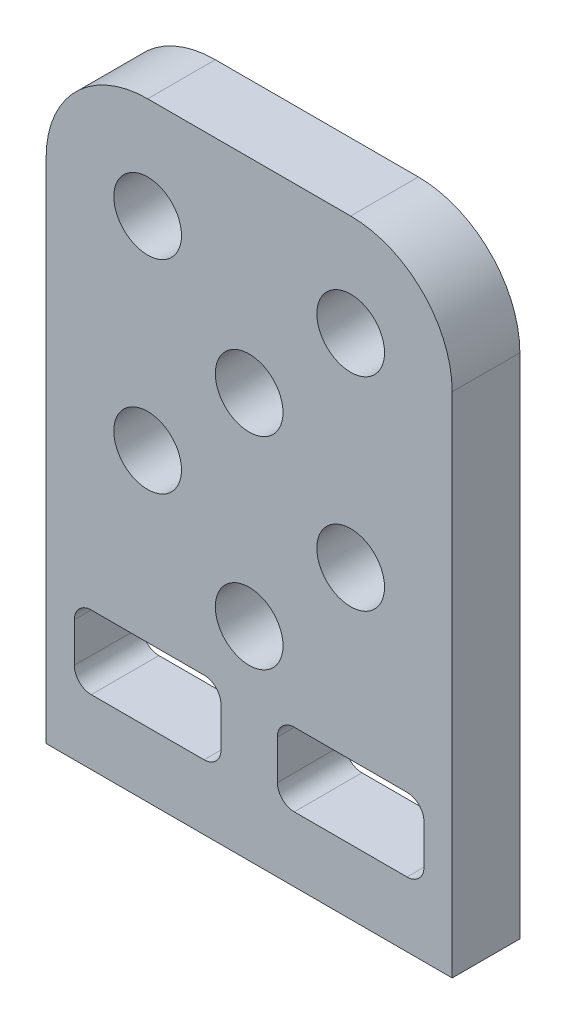
ISO-10303-21;
HEADER;
FILE_DESCRIPTION(('STEP AP214'),'2;1');
FILE_NAME('part.step','',(''),(''),'','','');
FILE_SCHEMA(('AUTOMOTIVE_DESIGN { 1 0 10303 214 1 1 1 1 }'));
ENDSEC;
DATA;
#1=APPLICATION_CONTEXT('core data for automotive mechanical design processes');
#2=APPLICATION_PROTOCOL_DEFINITION('international standard','automotive_design',2000,#1);
#3=PRODUCT_CONTEXT('',#1,'mechanical');
#4=PRODUCT('Part','Part','',(#3));
#5=PRODUCT_RELATED_PRODUCT_CATEGORY('part','',(#4));
#6=PRODUCT_DEFINITION_FORMATION('','',#4);
#7=PRODUCT_DEFINITION_CONTEXT('part definition',#1,'design');
#8=PRODUCT_DEFINITION('design','',#6,#7);
#9=PRODUCT_DEFINITION_SHAPE('','',#8);
#10=(LENGTH_UNIT() NAMED_UNIT(*) SI_UNIT(.MILLI.,.METRE.));
#11=(NAMED_UNIT(*) PLANE_ANGLE_UNIT() SI_UNIT($,.RADIAN.));
#12=(NAMED_UNIT(*) SI_UNIT($,.STERADIAN.) SOLID_ANGLE_UNIT());
#13=UNCERTAINTY_MEASURE_WITH_UNIT(LENGTH_MEASURE(1.E-05),#10,'distance_accuracy_value','');
#14=(GEOMETRIC_REPRESENTATION_CONTEXT(3) GLOBAL_UNCERTAINTY_ASSIGNED_CONTEXT((#13)) GLOBAL_UNIT_ASSIGNED_CONTEXT((#10,
#11,#12)) REPRESENTATION_CONTEXT('',''));
#15=CARTESIAN_POINT('',(0.,0.,0.));
#16=DIRECTION('',(0.,0.,1.));
#17=DIRECTION('',(1.,0.,0.));
#18=AXIS2_PLACEMENT_3D('',#15,#16,#17);
#19=CARTESIAN_POINT('',(178.7270545748,213.1787200631,3.));
#20=DIRECTION('',(0.,0.,1.));
#21=DIRECTION('',(1.,0.,0.));
#22=AXIS2_PLACEMENT_3D('',#19,#20,#21);
#23=PLANE('',#22);
#24=DIRECTION('',(1.,0.,0.));
#25=VECTOR('',#24,1.);
#26=CARTESIAN_POINT('',(190.2270584169,193.5537200631,3.));
#27=LINE('',#26,#25);
#28=CARTESIAN_POINT('',(185.2270584169,193.5537200631,3.));
#29=VERTEX_POINT('',#28);
#30=CARTESIAN_POINT('',(190.2270584169,193.5537200631,3.));
#31=VERTEX_POINT('',#30);
#32=EDGE_CURVE('E249',#29,#31,#27,.T.);
#33=ORIENTED_EDGE('',*,*,#32,.F.);
#34=CARTESIAN_POINT('',(185.2270584169,194.3037200631,3.));
#35=DIRECTION('',(0.,0.,1.));
#36=DIRECTION('',(1.,0.,0.));
#37=AXIS2_PLACEMENT_3D('',#34,#35,#36);
#38=CIRCLE('',#37,0.750000000000001);
#39=CARTESIAN_POINT('',(184.4770584169,194.3037200631,3.));
#40=VERTEX_POINT('',#39);
#41=EDGE_CURVE('E247',#40,#29,#38,.T.);
#42=ORIENTED_EDGE('',*,*,#41,.F.);
#43=DIRECTION('',(0.,-1.,0.));
#44=VECTOR('',#43,1.);
#45=CARTESIAN_POINT('',(184.4770584169,194.3037200631,3.));
#46=LINE('',#45,#44);
#47=CARTESIAN_POINT('',(184.4770584169,196.0537200631,3.));
#48=VERTEX_POINT('',#47);
#49=EDGE_CURVE('E263',#48,#40,#46,.T.);
#50=ORIENTED_EDGE('',*,*,#49,.F.);
#51=CARTESIAN_POINT('',(185.2270584169,196.0537200631,3.));
#52=DIRECTION('',(0.,0.,1.));
#53=DIRECTION('',(1.,0.,0.));
#54=AXIS2_PLACEMENT_3D('',#51,#52,#53);
#55=CIRCLE('',#54,0.750000000000001);
#56=CARTESIAN_POINT('',(185.2270584169,196.8037200631,3.));
#57=VERTEX_POINT('',#56);
#58=EDGE_CURVE('E260',#57,#48,#55,.T.);
#59=ORIENTED_EDGE('',*,*,#58,.F.);
#60=DIRECTION('',(-1.,0.,0.));
#61=VECTOR('',#60,1.);
#62=CARTESIAN_POINT('',(185.2270584169,196.8037200631,3.));
#63=LINE('',#62,#61);
#64=CARTESIAN_POINT('',(190.2270584169,196.8037200631,3.));
#65=VERTEX_POINT('',#64);
#66=EDGE_CURVE('E258',#65,#57,#63,.T.);
#67=ORIENTED_EDGE('',*,*,#66,.F.);
#68=CARTESIAN_POINT('',(190.2270584169,196.0537200631,3.));
#69=DIRECTION('',(0.,0.,1.));
#70=DIRECTION('',(1.,0.,0.));
#71=AXIS2_PLACEMENT_3D('',#68,#69,#70);
#72=CIRCLE('',#71,0.750000000000001);
#73=CARTESIAN_POINT('',(190.9770584169,196.0537200631,3.));
#74=VERTEX_POINT('',#73);
#75=EDGE_CURVE('E256',#74,#65,#72,.T.);
#76=ORIENTED_EDGE('',*,*,#75,.F.);
#77=DIRECTION('',(0.,1.,0.));
#78=VECTOR('',#77,1.);
#79=CARTESIAN_POINT('',(190.9770584169,196.0537200631,3.));
#80=LINE('',#79,#78);
#81=CARTESIAN_POINT('',(190.9770584169,194.3037200631,3.));
#82=VERTEX_POINT('',#81);
#83=EDGE_CURVE('E254',#82,#74,#80,.T.);
#84=ORIENTED_EDGE('',*,*,#83,.F.);
#85=CARTESIAN_POINT('',(190.2270584169,194.3037200631,3.));
#86=DIRECTION('',(0.,0.,1.));
#87=DIRECTION('',(1.,0.,0.));
#88=AXIS2_PLACEMENT_3D('',#85,#86,#87);
#89=CIRCLE('',#88,0.750000000000001);
#90=EDGE_CURVE('E252',#31,#82,#89,.T.);
#91=ORIENTED_EDGE('',*,*,#90,.F.);
#92=EDGE_LOOP('',(#33,#42,#50,#59,#67,#76,#84,#91));
#93=FACE_BOUND('',#92,.T.);
#94=CARTESIAN_POINT('',(187.7270545748,213.1787200631,3.));
#95=DIRECTION('',(0.,0.,1.));
#96=DIRECTION('',(1.,0.,0.));
#97=AXIS2_PLACEMENT_3D('',#94,#95,#96);
#98=CIRCLE('',#97,1.5);
#99=CARTESIAN_POINT('',(189.2270545748,213.1787200631,3.));
#100=VERTEX_POINT('',#99);
#101=EDGE_CURVE('E312',#100,#100,#98,.T.);
#102=ORIENTED_EDGE('',*,*,#101,.F.);
#103=EDGE_LOOP('',(#102));
#104=FACE_BOUND('',#103,.T.);
#105=CARTESIAN_POINT('',(187.7270545748,204.1787200631,3.));
#106=DIRECTION('',(0.,0.,1.));
#107=DIRECTION('',(1.,0.,0.));
#108=AXIS2_PLACEMENT_3D('',#105,#106,#107);
#109=CIRCLE('',#108,1.5);
#110=CARTESIAN_POINT('',(189.2270545748,204.1787200631,3.));
#111=VERTEX_POINT('',#110);
#112=EDGE_CURVE('E324',#111,#111,#109,.T.);
#113=ORIENTED_EDGE('',*,*,#112,.F.);
#114=EDGE_LOOP('',(#113));
#115=FACE_BOUND('',#114,.T.);
#116=CARTESIAN_POINT('',(183.2270545748,199.6787200631,3.));
#117=DIRECTION('',(0.,0.,1.));
#118=DIRECTION('',(1.,0.,0.));
#119=AXIS2_PLACEMENT_3D('',#116,#117,#118);
#120=CIRCLE('',#119,1.5);
#121=CARTESIAN_POINT('',(184.7270545748,199.6787200631,3.));
#122=VERTEX_POINT('',#121);
#123=EDGE_CURVE('E336',#122,#122,#120,.T.);
#124=ORIENTED_EDGE('',*,*,#123,.F.);
#125=EDGE_LOOP('',(#124));
#126=FACE_BOUND('',#125,.T.);
#127=CARTESIAN_POINT('',(178.7270545748,213.1787200631,3.));
#128=DIRECTION('',(0.,0.,1.));
#129=DIRECTION('',(1.,0.,0.));
#130=AXIS2_PLACEMENT_3D('',#127,#128,#129);
#131=CIRCLE('',#130,4.5);
#132=CARTESIAN_POINT('',(178.7270545748,217.6787200631,3.));
#133=VERTEX_POINT('',#132);
#134=CARTESIAN_POINT('',(174.2270545748,213.1787200631,3.));
#135=VERTEX_POINT('',#134);
#136=EDGE_CURVE('E342',#133,#135,#131,.T.);
#137=ORIENTED_EDGE('',*,*,#136,.T.);
#138=DIRECTION('',(0.,-1.,0.));
#139=VECTOR('',#138,1.);
#140=CARTESIAN_POINT('',(174.2270545748,213.1787200631,3.));
#141=LINE('',#140,#139);
#142=CARTESIAN_POINT('',(174.2270545748,190.6758849413,3.));
#143=VERTEX_POINT('',#142);
#144=EDGE_CURVE('E345',#135,#143,#141,.T.);
#145=ORIENTED_EDGE('',*,*,#144,.T.);
#146=DIRECTION('',(1.,0.,0.));
#147=VECTOR('',#146,1.);
#148=CARTESIAN_POINT('',(174.2270545748,190.6758849413,3.));
#149=LINE('',#148,#147);
#150=CARTESIAN_POINT('',(192.2270545748,190.6758849413,3.));
#151=VERTEX_POINT('',#150);
#152=EDGE_CURVE('E348',#143,#151,#149,.T.);
#153=ORIENTED_EDGE('',*,*,#152,.T.);
#154=DIRECTION('',(0.,1.,0.));
#155=VECTOR('',#154,1.);
#156=CARTESIAN_POINT('',(192.2270545748,190.6758849413,3.));
#157=LINE('',#156,#155);
#158=CARTESIAN_POINT('',(192.2270545748,213.1787200631,3.));
#159=VERTEX_POINT('',#158);
#160=EDGE_CURVE('E350',#151,#159,#157,.T.);
#161=ORIENTED_EDGE('',*,*,#160,.T.);
#162=CARTESIAN_POINT('',(187.7270545748,213.1787200631,3.));
#163=DIRECTION('',(0.,0.,1.));
#164=DIRECTION('',(1.,0.,0.));
#165=AXIS2_PLACEMENT_3D('',#162,#163,#164);
#166=CIRCLE('',#165,4.5);
#167=CARTESIAN_POINT('',(187.7270545748,217.6787200631,3.));
#168=VERTEX_POINT('',#167);
#169=EDGE_CURVE('E352',#159,#168,#166,.T.);
#170=ORIENTED_EDGE('',*,*,#169,.T.);
#171=DIRECTION('',(-1.,0.,0.));
#172=VECTOR('',#171,1.);
#173=CARTESIAN_POINT('',(187.7270545748,217.6787200631,3.));
#174=LINE('',#173,#172);
#175=EDGE_CURVE('E354',#168,#133,#174,.T.);
#176=ORIENTED_EDGE('',*,*,#175,.T.);
#177=EDGE_LOOP('',(#137,#145,#153,#161,#170,#176));
#178=FACE_BOUND('',#177,.T.);
#179=CARTESIAN_POINT('',(183.2270545748,208.632069818,3.));
#180=DIRECTION('',(0.,0.,1.));
#181=DIRECTION('',(1.,0.,0.));
#182=AXIS2_PLACEMENT_3D('',#179,#180,#181);
#183=CIRCLE('',#182,1.5);
#184=CARTESIAN_POINT('',(184.7270545748,208.632069818,3.));
#185=VERTEX_POINT('',#184);
#186=EDGE_CURVE('E330',#185,#185,#183,.T.);
#187=ORIENTED_EDGE('',*,*,#186,.F.);
#188=EDGE_LOOP('',(#187));
#189=FACE_BOUND('',#188,.T.);
#190=CARTESIAN_POINT('',(178.7270545748,204.1787200631,3.));
#191=DIRECTION('',(0.,0.,1.));
#192=DIRECTION('',(1.,0.,0.));
#193=AXIS2_PLACEMENT_3D('',#190,#191,#192);
#194=CIRCLE('',#193,1.5);
#195=CARTESIAN_POINT('',(180.2270545748,204.1787200631,3.));
#196=VERTEX_POINT('',#195);
#197=EDGE_CURVE('E318',#196,#196,#194,.T.);
#198=ORIENTED_EDGE('',*,*,#197,.F.);
#199=EDGE_LOOP('',(#198));
#200=FACE_BOUND('',#199,.T.);
#201=CARTESIAN_POINT('',(178.7270545748,213.1787200631,3.));
#202=DIRECTION('',(0.,0.,1.));
#203=DIRECTION('',(1.,0.,0.));
#204=AXIS2_PLACEMENT_3D('',#201,#202,#203);
#205=CIRCLE('',#204,1.5);
#206=CARTESIAN_POINT('',(180.2270545748,213.1787200631,3.));
#207=VERTEX_POINT('',#206);
#208=EDGE_CURVE('E306',#207,#207,#205,.T.);
#209=ORIENTED_EDGE('',*,*,#208,.F.);
#210=EDGE_LOOP('',(#209));
#211=FACE_BOUND('',#210,.T.);
#212=DIRECTION('',(1.,0.,0.));
#213=VECTOR('',#212,1.);
#214=CARTESIAN_POINT('',(181.2270584169,193.5537200631,3.));
#215=LINE('',#214,#213);
#216=CARTESIAN_POINT('',(176.2270584169,193.5537200631,3.));
#217=VERTEX_POINT('',#216);
#218=CARTESIAN_POINT('',(181.2270584169,193.5537200631,3.));
#219=VERTEX_POINT('',#218);
#220=EDGE_CURVE('E190',#217,#219,#215,.T.);
#221=ORIENTED_EDGE('',*,*,#220,.F.);
#222=CARTESIAN_POINT('',(176.2270584169,194.3037200631,3.));
#223=DIRECTION('',(0.,0.,1.));
#224=DIRECTION('',(1.,0.,0.));
#225=AXIS2_PLACEMENT_3D('',#222,#223,#224);
#226=CIRCLE('',#225,0.750000000000001);
#227=CARTESIAN_POINT('',(175.4770584169,194.3037200631,3.));
#228=VERTEX_POINT('',#227);
#229=EDGE_CURVE('E182',#228,#217,#226,.T.);
#230=ORIENTED_EDGE('',*,*,#229,.F.);
#231=DIRECTION('',(0.,-1.,0.));
#232=VECTOR('',#231,1.);
#233=CARTESIAN_POINT('',(175.4770584169,194.3037200631,3.));
#234=LINE('',#233,#232);
#235=CARTESIAN_POINT('',(175.4770584169,196.0537200631,3.));
#236=VERTEX_POINT('',#235);
#237=EDGE_CURVE('E215',#236,#228,#234,.T.);
#238=ORIENTED_EDGE('',*,*,#237,.F.);
#239=CARTESIAN_POINT('',(176.2270584169,196.0537200631,3.));
#240=DIRECTION('',(0.,0.,1.));
#241=DIRECTION('',(1.,0.,0.));
#242=AXIS2_PLACEMENT_3D('',#239,#240,#241);
#243=CIRCLE('',#242,0.750000000000001);
#244=CARTESIAN_POINT('',(176.2270584169,196.8037200631,3.));
#245=VERTEX_POINT('',#244);
#246=EDGE_CURVE('E213',#245,#236,#243,.T.);
#247=ORIENTED_EDGE('',*,*,#246,.F.);
#248=DIRECTION('',(-1.,0.,0.));
#249=VECTOR('',#248,1.);
#250=CARTESIAN_POINT('',(176.2270584169,196.8037200631,3.));
#251=LINE('',#250,#249);
#252=CARTESIAN_POINT('',(181.2270584169,196.8037200631,3.));
#253=VERTEX_POINT('',#252);
#254=EDGE_CURVE('E211',#253,#245,#251,.T.);
#255=ORIENTED_EDGE('',*,*,#254,.F.);
#256=CARTESIAN_POINT('',(181.2270584169,196.0537200631,3.));
#257=DIRECTION('',(0.,0.,1.));
#258=DIRECTION('',(1.,0.,0.));
#259=AXIS2_PLACEMENT_3D('',#256,#257,#258);
#260=CIRCLE('',#259,0.750000000000001);
#261=CARTESIAN_POINT('',(181.9770584169,196.0537200631,3.));
#262=VERTEX_POINT('',#261);
#263=EDGE_CURVE('E209',#262,#253,#260,.T.);
#264=ORIENTED_EDGE('',*,*,#263,.F.);
#265=DIRECTION('',(0.,1.,0.));
#266=VECTOR('',#265,1.);
#267=CARTESIAN_POINT('',(181.9770584169,196.0537200631,3.));
#268=LINE('',#267,#266);
#269=CARTESIAN_POINT('',(181.9770584169,194.3037200631,3.));
#270=VERTEX_POINT('',#269);
#271=EDGE_CURVE('E205',#270,#262,#268,.T.);
#272=ORIENTED_EDGE('',*,*,#271,.F.);
#273=CARTESIAN_POINT('',(181.2270584169,194.3037200631,3.));
#274=DIRECTION('',(0.,0.,1.));
#275=DIRECTION('',(1.,0.,0.));
#276=AXIS2_PLACEMENT_3D('',#273,#274,#275);
#277=CIRCLE('',#276,0.750000000000001);
#278=EDGE_CURVE('E203',#219,#270,#277,.T.);
#279=ORIENTED_EDGE('',*,*,#278,.F.);
#280=EDGE_LOOP('',(#221,#230,#238,#247,#255,#264,#272,#279));
#281=FACE_BOUND('',#280,.T.);
#282=ADVANCED_FACE('F33',(#93,#104,#115,#126,#178,#189,#200,#211,#281),#23,.T.);
#283=CARTESIAN_POINT('',(178.7270545748,213.1787200631,0.));
#284=DIRECTION('',(0.,0.,1.));
#285=DIRECTION('',(1.,0.,0.));
#286=AXIS2_PLACEMENT_3D('',#283,#284,#285);
#287=PLANE('',#286);
#288=CARTESIAN_POINT('',(185.2270584169,194.3037200631,0.));
#289=DIRECTION('',(0.,0.,1.));
#290=DIRECTION('',(1.,0.,0.));
#291=AXIS2_PLACEMENT_3D('',#288,#289,#290);
#292=CIRCLE('',#291,0.750000000000001);
#293=CARTESIAN_POINT('',(184.4770584169,194.3037200631,0.));
#294=VERTEX_POINT('',#293);
#295=CARTESIAN_POINT('',(185.2270584169,193.5537200631,0.));
#296=VERTEX_POINT('',#295);
#297=EDGE_CURVE('E198',#294,#296,#292,.T.);
#298=ORIENTED_EDGE('',*,*,#297,.T.);
#299=DIRECTION('',(1.,0.,0.));
#300=VECTOR('',#299,1.);
#301=CARTESIAN_POINT('',(190.2270584169,193.5537200631,0.));
#302=LINE('',#301,#300);
#303=CARTESIAN_POINT('',(190.2270584169,193.5537200631,0.));
#304=VERTEX_POINT('',#303);
#305=EDGE_CURVE('E268',#296,#304,#302,.T.);
#306=ORIENTED_EDGE('',*,*,#305,.T.);
#307=CARTESIAN_POINT('',(190.2270584169,194.3037200631,0.));
#308=DIRECTION('',(0.,0.,1.));
#309=DIRECTION('',(1.,0.,0.));
#310=AXIS2_PLACEMENT_3D('',#307,#308,#309);
#311=CIRCLE('',#310,0.750000000000001);
#312=CARTESIAN_POINT('',(190.9770584169,194.3037200631,0.));
#313=VERTEX_POINT('',#312);
#314=EDGE_CURVE('E271',#304,#313,#311,.T.);
#315=ORIENTED_EDGE('',*,*,#314,.T.);
#316=DIRECTION('',(0.,1.,0.));
#317=VECTOR('',#316,1.);
#318=CARTESIAN_POINT('',(190.9770584169,196.0537200631,0.));
#319=LINE('',#318,#317);
#320=CARTESIAN_POINT('',(190.9770584169,196.0537200631,0.));
#321=VERTEX_POINT('',#320);
#322=EDGE_CURVE('E274',#313,#321,#319,.T.);
#323=ORIENTED_EDGE('',*,*,#322,.T.);
#324=CARTESIAN_POINT('',(190.2270584169,196.0537200631,0.));
#325=DIRECTION('',(0.,0.,1.));
#326=DIRECTION('',(1.,0.,0.));
#327=AXIS2_PLACEMENT_3D('',#324,#325,#326);
#328=CIRCLE('',#327,0.750000000000001);
#329=CARTESIAN_POINT('',(190.2270584169,196.8037200631,0.));
#330=VERTEX_POINT('',#329);
#331=EDGE_CURVE('E277',#321,#330,#328,.T.);
#332=ORIENTED_EDGE('',*,*,#331,.T.);
#333=DIRECTION('',(-1.,0.,0.));
#334=VECTOR('',#333,1.);
#335=CARTESIAN_POINT('',(185.2270584169,196.8037200631,0.));
#336=LINE('',#335,#334);
#337=CARTESIAN_POINT('',(185.2270584169,196.8037200631,0.));
#338=VERTEX_POINT('',#337);
#339=EDGE_CURVE('E280',#330,#338,#336,.T.);
#340=ORIENTED_EDGE('',*,*,#339,.T.);
#341=CARTESIAN_POINT('',(185.2270584169,196.0537200631,0.));
#342=DIRECTION('',(0.,0.,1.));
#343=DIRECTION('',(1.,0.,0.));
#344=AXIS2_PLACEMENT_3D('',#341,#342,#343);
#345=CIRCLE('',#344,0.750000000000001);
#346=CARTESIAN_POINT('',(184.4770584169,196.0537200631,0.));
#347=VERTEX_POINT('',#346);
#348=EDGE_CURVE('E283',#338,#347,#345,.T.);
#349=ORIENTED_EDGE('',*,*,#348,.T.);
#350=DIRECTION('',(0.,-1.,0.));
#351=VECTOR('',#350,1.);
#352=CARTESIAN_POINT('',(184.4770584169,194.3037200631,0.));
#353=LINE('',#352,#351);
#354=EDGE_CURVE('E250',#347,#294,#353,.T.);
#355=ORIENTED_EDGE('',*,*,#354,.T.);
#356=EDGE_LOOP('',(#298,#306,#315,#323,#332,#340,#349,#355));
#357=FACE_BOUND('',#356,.T.);
#358=CARTESIAN_POINT('',(187.7270545748,213.1787200631,0.));
#359=DIRECTION('',(0.,0.,1.));
#360=DIRECTION('',(1.,0.,0.));
#361=AXIS2_PLACEMENT_3D('',#358,#359,#360);
#362=CIRCLE('',#361,1.5);
#363=CARTESIAN_POINT('',(189.2270545748,213.1787200631,0.));
#364=VERTEX_POINT('',#363);
#365=EDGE_CURVE('E309',#364,#364,#362,.T.);
#366=ORIENTED_EDGE('',*,*,#365,.T.);
#367=EDGE_LOOP('',(#366));
#368=FACE_BOUND('',#367,.T.);
#369=CARTESIAN_POINT('',(187.7270545748,204.1787200631,0.));
#370=DIRECTION('',(0.,0.,1.));
#371=DIRECTION('',(1.,0.,0.));
#372=AXIS2_PLACEMENT_3D('',#369,#370,#371);
#373=CIRCLE('',#372,1.5);
#374=CARTESIAN_POINT('',(189.2270545748,204.1787200631,0.));
#375=VERTEX_POINT('',#374);
#376=EDGE_CURVE('E321',#375,#375,#373,.T.);
#377=ORIENTED_EDGE('',*,*,#376,.T.);
#378=EDGE_LOOP('',(#377));
#379=FACE_BOUND('',#378,.T.);
#380=CARTESIAN_POINT('',(183.2270545748,199.6787200631,0.));
#381=DIRECTION('',(0.,0.,1.));
#382=DIRECTION('',(1.,0.,0.));
#383=AXIS2_PLACEMENT_3D('',#380,#381,#382);
#384=CIRCLE('',#383,1.5);
#385=CARTESIAN_POINT('',(184.7270545748,199.6787200631,0.));
#386=VERTEX_POINT('',#385);
#387=EDGE_CURVE('E333',#386,#386,#384,.T.);
#388=ORIENTED_EDGE('',*,*,#387,.T.);
#389=EDGE_LOOP('',(#388));
#390=FACE_BOUND('',#389,.T.);
#391=CARTESIAN_POINT('',(178.7270545748,213.1787200631,0.));
#392=DIRECTION('',(0.,0.,1.));
#393=DIRECTION('',(1.,0.,0.));
#394=AXIS2_PLACEMENT_3D('',#391,#392,#393);
#395=CIRCLE('',#394,4.5);
#396=CARTESIAN_POINT('',(178.7270545748,217.6787200631,0.));
#397=VERTEX_POINT('',#396);
#398=CARTESIAN_POINT('',(174.2270545748,213.1787200631,0.));
#399=VERTEX_POINT('',#398);
#400=EDGE_CURVE('E339',#397,#399,#395,.T.);
#401=ORIENTED_EDGE('',*,*,#400,.F.);
#402=DIRECTION('',(-1.,0.,0.));
#403=VECTOR('',#402,1.);
#404=CARTESIAN_POINT('',(187.7270545748,217.6787200631,0.));
#405=LINE('',#404,#403);
#406=CARTESIAN_POINT('',(187.7270545748,217.6787200631,0.));
#407=VERTEX_POINT('',#406);
#408=EDGE_CURVE('E346',#407,#397,#405,.T.);
#409=ORIENTED_EDGE('',*,*,#408,.F.);
#410=CARTESIAN_POINT('',(187.7270545748,213.1787200631,0.));
#411=DIRECTION('',(0.,0.,1.));
#412=DIRECTION('',(1.,0.,0.));
#413=AXIS2_PLACEMENT_3D('',#410,#411,#412);
#414=CIRCLE('',#413,4.5);
#415=CARTESIAN_POINT('',(192.2270545748,213.1787200631,0.));
#416=VERTEX_POINT('',#415);
#417=EDGE_CURVE('E365',#416,#407,#414,.T.);
#418=ORIENTED_EDGE('',*,*,#417,.F.);
#419=DIRECTION('',(0.,1.,0.));
#420=VECTOR('',#419,1.);
#421=CARTESIAN_POINT('',(192.2270545748,190.6758849413,0.));
#422=LINE('',#421,#420);
#423=CARTESIAN_POINT('',(192.2270545748,190.6758849413,0.));
#424=VERTEX_POINT('',#423);
#425=EDGE_CURVE('E363',#424,#416,#422,.T.);
#426=ORIENTED_EDGE('',*,*,#425,.F.);
#427=DIRECTION('',(1.,0.,0.));
#428=VECTOR('',#427,1.);
#429=CARTESIAN_POINT('',(174.2270545748,190.6758849413,0.));
#430=LINE('',#429,#428);
#431=CARTESIAN_POINT('',(174.2270545748,190.6758849413,0.));
#432=VERTEX_POINT('',#431);
#433=EDGE_CURVE('E361',#432,#424,#430,.T.);
#434=ORIENTED_EDGE('',*,*,#433,.F.);
#435=DIRECTION('',(0.,-1.,0.));
#436=VECTOR('',#435,1.);
#437=CARTESIAN_POINT('',(174.2270545748,213.1787200631,0.));
#438=LINE('',#437,#436);
#439=EDGE_CURVE('E359',#399,#432,#438,.T.);
#440=ORIENTED_EDGE('',*,*,#439,.F.);
#441=EDGE_LOOP('',(#401,#409,#418,#426,#434,#440));
#442=FACE_BOUND('',#441,.T.);
#443=CARTESIAN_POINT('',(183.2270545748,208.632069818,0.));
#444=DIRECTION('',(0.,0.,1.));
#445=DIRECTION('',(1.,0.,0.));
#446=AXIS2_PLACEMENT_3D('',#443,#444,#445);
#447=CIRCLE('',#446,1.5);
#448=CARTESIAN_POINT('',(184.7270545748,208.632069818,0.));
#449=VERTEX_POINT('',#448);
#450=EDGE_CURVE('E327',#449,#449,#447,.T.);
#451=ORIENTED_EDGE('',*,*,#450,.T.);
#452=EDGE_LOOP('',(#451));
#453=FACE_BOUND('',#452,.T.);
#454=CARTESIAN_POINT('',(178.7270545748,204.1787200631,0.));
#455=DIRECTION('',(0.,0.,1.));
#456=DIRECTION('',(1.,0.,0.));
#457=AXIS2_PLACEMENT_3D('',#454,#455,#456);
#458=CIRCLE('',#457,1.5);
#459=CARTESIAN_POINT('',(180.2270545748,204.1787200631,0.));
#460=VERTEX_POINT('',#459);
#461=EDGE_CURVE('E315',#460,#460,#458,.T.);
#462=ORIENTED_EDGE('',*,*,#461,.T.);
#463=EDGE_LOOP('',(#462));
#464=FACE_BOUND('',#463,.T.);
#465=CARTESIAN_POINT('',(178.7270545748,213.1787200631,0.));
#466=DIRECTION('',(0.,0.,1.));
#467=DIRECTION('',(1.,0.,0.));
#468=AXIS2_PLACEMENT_3D('',#465,#466,#467);
#469=CIRCLE('',#468,1.5);
#470=CARTESIAN_POINT('',(180.2270545748,213.1787200631,0.));
#471=VERTEX_POINT('',#470);
#472=EDGE_CURVE('E305',#471,#471,#469,.T.);
#473=ORIENTED_EDGE('',*,*,#472,.T.);
#474=EDGE_LOOP('',(#473));
#475=FACE_BOUND('',#474,.T.);
#476=CARTESIAN_POINT('',(176.2270584169,194.3037200631,0.));
#477=DIRECTION('',(0.,0.,1.));
#478=DIRECTION('',(1.,0.,0.));
#479=AXIS2_PLACEMENT_3D('',#476,#477,#478);
#480=CIRCLE('',#479,0.750000000000001);
#481=CARTESIAN_POINT('',(175.4770584169,194.3037200631,0.));
#482=VERTEX_POINT('',#481);
#483=CARTESIAN_POINT('',(176.2270584169,193.5537200631,0.));
#484=VERTEX_POINT('',#483);
#485=EDGE_CURVE('E56',#482,#484,#480,.T.);
#486=ORIENTED_EDGE('',*,*,#485,.T.);
#487=DIRECTION('',(1.,0.,0.));
#488=VECTOR('',#487,1.);
#489=CARTESIAN_POINT('',(181.2270584169,193.5537200631,0.));
#490=LINE('',#489,#488);
#491=CARTESIAN_POINT('',(181.2270584169,193.5537200631,0.));
#492=VERTEX_POINT('',#491);
#493=EDGE_CURVE('E197',#484,#492,#490,.T.);
#494=ORIENTED_EDGE('',*,*,#493,.T.);
#495=CARTESIAN_POINT('',(181.2270584169,194.3037200631,0.));
#496=DIRECTION('',(0.,0.,1.));
#497=DIRECTION('',(1.,0.,0.));
#498=AXIS2_PLACEMENT_3D('',#495,#496,#497);
#499=CIRCLE('',#498,0.750000000000001);
#500=CARTESIAN_POINT('',(181.9770584169,194.3037200631,0.));
#501=VERTEX_POINT('',#500);
#502=EDGE_CURVE('E219',#492,#501,#499,.T.);
#503=ORIENTED_EDGE('',*,*,#502,.T.);
#504=DIRECTION('',(0.,1.,0.));
#505=VECTOR('',#504,1.);
#506=CARTESIAN_POINT('',(181.9770584169,196.0537200631,0.));
#507=LINE('',#506,#505);
#508=CARTESIAN_POINT('',(181.9770584169,196.0537200631,0.));
#509=VERTEX_POINT('',#508);
#510=EDGE_CURVE('E222',#501,#509,#507,.T.);
#511=ORIENTED_EDGE('',*,*,#510,.T.);
#512=CARTESIAN_POINT('',(181.2270584169,196.0537200631,0.));
#513=DIRECTION('',(0.,0.,1.));
#514=DIRECTION('',(1.,0.,0.));
#515=AXIS2_PLACEMENT_3D('',#512,#513,#514);
#516=CIRCLE('',#515,0.750000000000001);
#517=CARTESIAN_POINT('',(181.2270584169,196.8037200631,0.));
#518=VERTEX_POINT('',#517);
#519=EDGE_CURVE('E225',#509,#518,#516,.T.);
#520=ORIENTED_EDGE('',*,*,#519,.T.);
#521=DIRECTION('',(-1.,0.,0.));
#522=VECTOR('',#521,1.);
#523=CARTESIAN_POINT('',(176.2270584169,196.8037200631,0.));
#524=LINE('',#523,#522);
#525=CARTESIAN_POINT('',(176.2270584169,196.8037200631,0.));
#526=VERTEX_POINT('',#525);
#527=EDGE_CURVE('E228',#518,#526,#524,.T.);
#528=ORIENTED_EDGE('',*,*,#527,.T.);
#529=CARTESIAN_POINT('',(176.2270584169,196.0537200631,0.));
#530=DIRECTION('',(0.,0.,1.));
#531=DIRECTION('',(1.,0.,0.));
#532=AXIS2_PLACEMENT_3D('',#529,#530,#531);
#533=CIRCLE('',#532,0.750000000000001);
#534=CARTESIAN_POINT('',(175.4770584169,196.0537200631,0.));
#535=VERTEX_POINT('',#534);
#536=EDGE_CURVE('E231',#526,#535,#533,.T.);
#537=ORIENTED_EDGE('',*,*,#536,.T.);
#538=DIRECTION('',(0.,-1.,0.));
#539=VECTOR('',#538,1.);
#540=CARTESIAN_POINT('',(175.4770584169,194.3037200631,0.));
#541=LINE('',#540,#539);
#542=EDGE_CURVE('E191',#535,#482,#541,.T.);
#543=ORIENTED_EDGE('',*,*,#542,.T.);
#544=EDGE_LOOP('',(#486,#494,#503,#511,#520,#528,#537,#543));
#545=FACE_BOUND('',#544,.T.);
#546=ADVANCED_FACE('F389',(#357,#368,#379,#390,#442,#453,#464,#475,#545),#287,.F.);
#547=CARTESIAN_POINT('',(178.7270545748,213.1787200631,3.));
#548=DIRECTION('',(0.,0.,-1.));
#549=DIRECTION('',(-1.,0.,0.));
#550=AXIS2_PLACEMENT_3D('',#547,#548,#549);
#551=CYLINDRICAL_SURFACE('',#550,4.5);
#552=ORIENTED_EDGE('',*,*,#400,.T.);
#553=DIRECTION('',(0.,0.,-1.));
#554=VECTOR('',#553,1.);
#555=CARTESIAN_POINT('',(174.2270545748,213.1787200631,3.));
#556=LINE('',#555,#554);
#557=EDGE_CURVE('E11',#135,#399,#556,.T.);
#558=ORIENTED_EDGE('',*,*,#557,.F.);
#559=ORIENTED_EDGE('',*,*,#136,.F.);
#560=DIRECTION('',(0.,0.,-1.));
#561=VECTOR('',#560,1.);
#562=CARTESIAN_POINT('',(178.7270545748,217.6787200631,3.));
#563=LINE('',#562,#561);
#564=EDGE_CURVE('E356',#133,#397,#563,.T.);
#565=ORIENTED_EDGE('',*,*,#564,.T.);
#566=EDGE_LOOP('',(#552,#558,#559,#565));
#567=FACE_BOUND('',#566,.T.);
#568=ADVANCED_FACE('F35',(#567),#551,.T.);
#569=CARTESIAN_POINT('',(174.2270545748,213.1787200631,3.));
#570=DIRECTION('',(1.,0.,0.));
#571=DIRECTION('',(0.,0.,-1.));
#572=AXIS2_PLACEMENT_3D('',#569,#570,#571);
#573=PLANE('',#572);
#574=ORIENTED_EDGE('',*,*,#439,.T.);
#575=DIRECTION('',(0.,0.,-1.));
#576=VECTOR('',#575,1.);
#577=CARTESIAN_POINT('',(174.2270545748,190.6758849413,3.));
#578=LINE('',#577,#576);
#579=EDGE_CURVE('E41',#143,#432,#578,.T.);
#580=ORIENTED_EDGE('',*,*,#579,.F.);
#581=ORIENTED_EDGE('',*,*,#144,.F.);
#582=ORIENTED_EDGE('',*,*,#557,.T.);
#583=EDGE_LOOP('',(#574,#580,#581,#582));
#584=FACE_BOUND('',#583,.T.);
#585=ADVANCED_FACE('F407',(#584),#573,.F.);
#586=CARTESIAN_POINT('',(174.2270545748,190.6758849413,3.));
#587=DIRECTION('',(0.,1.,0.));
#588=DIRECTION('',(0.,0.,1.));
#589=AXIS2_PLACEMENT_3D('',#586,#587,#588);
#590=PLANE('',#589);
#591=ORIENTED_EDGE('',*,*,#433,.T.);
#592=DIRECTION('',(0.,0.,-1.));
#593=VECTOR('',#592,1.);
#594=CARTESIAN_POINT('',(192.2270545748,190.6758849413,3.));
#595=LINE('',#594,#593);
#596=EDGE_CURVE('E376',#151,#424,#595,.T.);
#597=ORIENTED_EDGE('',*,*,#596,.F.);
#598=ORIENTED_EDGE('',*,*,#152,.F.);
#599=ORIENTED_EDGE('',*,*,#579,.T.);
#600=EDGE_LOOP('',(#591,#597,#598,#599));
#601=FACE_BOUND('',#600,.T.);
#602=ADVANCED_FACE('F383',(#601),#590,.F.);
#603=CARTESIAN_POINT('',(192.2270545748,190.6758849413,3.));
#604=DIRECTION('',(-1.,0.,0.));
#605=DIRECTION('',(0.,0.,1.));
#606=AXIS2_PLACEMENT_3D('',#603,#604,#605);
#607=PLANE('',#606);
#608=ORIENTED_EDGE('',*,*,#425,.T.);
#609=DIRECTION('',(0.,0.,-1.));
#610=VECTOR('',#609,1.);
#611=CARTESIAN_POINT('',(192.2270545748,213.1787200631,3.));
#612=LINE('',#611,#610);
#613=EDGE_CURVE('E373',#159,#416,#612,.T.);
#614=ORIENTED_EDGE('',*,*,#613,.F.);
#615=ORIENTED_EDGE('',*,*,#160,.F.);
#616=ORIENTED_EDGE('',*,*,#596,.T.);
#617=EDGE_LOOP('',(#608,#614,#615,#616));
#618=FACE_BOUND('',#617,.T.);
#619=ADVANCED_FACE('F395',(#618),#607,.F.);
#620=CARTESIAN_POINT('',(187.7270545748,213.1787200631,3.));
#621=DIRECTION('',(0.,0.,-1.));
#622=DIRECTION('',(-1.,0.,0.));
#623=AXIS2_PLACEMENT_3D('',#620,#621,#622);
#624=CYLINDRICAL_SURFACE('',#623,4.5);
#625=ORIENTED_EDGE('',*,*,#417,.T.);
#626=DIRECTION('',(0.,0.,-1.));
#627=VECTOR('',#626,1.);
#628=CARTESIAN_POINT('',(187.7270545748,217.6787200631,3.));
#629=LINE('',#628,#627);
#630=EDGE_CURVE('E370',#168,#407,#629,.T.);
#631=ORIENTED_EDGE('',*,*,#630,.F.);
#632=ORIENTED_EDGE('',*,*,#169,.F.);
#633=ORIENTED_EDGE('',*,*,#613,.T.);
#634=EDGE_LOOP('',(#625,#631,#632,#633));
#635=FACE_BOUND('',#634,.T.);
#636=ADVANCED_FACE('F399',(#635),#624,.T.);
#637=CARTESIAN_POINT('',(187.7270545748,217.6787200631,3.));
#638=DIRECTION('',(0.,-1.,0.));
#639=DIRECTION('',(0.,0.,-1.));
#640=AXIS2_PLACEMENT_3D('',#637,#638,#639);
#641=PLANE('',#640);
#642=ORIENTED_EDGE('',*,*,#408,.T.);
#643=ORIENTED_EDGE('',*,*,#564,.F.);
#644=ORIENTED_EDGE('',*,*,#175,.F.);
#645=ORIENTED_EDGE('',*,*,#630,.T.);
#646=EDGE_LOOP('',(#642,#643,#644,#645));
#647=FACE_BOUND('',#646,.T.);
#648=ADVANCED_FACE('F410',(#647),#641,.F.);
#649=CARTESIAN_POINT('',(183.2270545748,199.6787200631,3.));
#650=DIRECTION('',(0.,0.,-1.));
#651=DIRECTION('',(-1.,0.,0.));
#652=AXIS2_PLACEMENT_3D('',#649,#650,#651);
#653=CYLINDRICAL_SURFACE('',#652,1.5);
#654=ORIENTED_EDGE('',*,*,#123,.T.);
#655=EDGE_LOOP('',(#654));
#656=FACE_BOUND('',#655,.T.);
#657=ORIENTED_EDGE('',*,*,#387,.F.);
#658=EDGE_LOOP('',(#657));
#659=FACE_BOUND('',#658,.T.);
#660=ADVANCED_FACE('F412',(#656,#659),#653,.F.);
#661=CARTESIAN_POINT('',(183.2270545748,208.632069818,3.));
#662=DIRECTION('',(0.,0.,-1.));
#663=DIRECTION('',(-1.,0.,0.));
#664=AXIS2_PLACEMENT_3D('',#661,#662,#663);
#665=CYLINDRICAL_SURFACE('',#664,1.5);
#666=ORIENTED_EDGE('',*,*,#186,.T.);
#667=EDGE_LOOP('',(#666));
#668=FACE_BOUND('',#667,.T.);
#669=ORIENTED_EDGE('',*,*,#450,.F.);
#670=EDGE_LOOP('',(#669));
#671=FACE_BOUND('',#670,.T.);
#672=ADVANCED_FACE('F418',(#668,#671),#665,.F.);
#673=CARTESIAN_POINT('',(187.7270545748,204.1787200631,3.));
#674=DIRECTION('',(0.,0.,-1.));
#675=DIRECTION('',(-1.,0.,0.));
#676=AXIS2_PLACEMENT_3D('',#673,#674,#675);
#677=CYLINDRICAL_SURFACE('',#676,1.5);
#678=ORIENTED_EDGE('',*,*,#112,.T.);
#679=EDGE_LOOP('',(#678));
#680=FACE_BOUND('',#679,.T.);
#681=ORIENTED_EDGE('',*,*,#376,.F.);
#682=EDGE_LOOP('',(#681));
#683=FACE_BOUND('',#682,.T.);
#684=ADVANCED_FACE('F435',(#680,#683),#677,.F.);
#685=CARTESIAN_POINT('',(178.7270545748,204.1787200631,3.));
#686=DIRECTION('',(0.,0.,-1.));
#687=DIRECTION('',(-1.,0.,0.));
#688=AXIS2_PLACEMENT_3D('',#685,#686,#687);
#689=CYLINDRICAL_SURFACE('',#688,1.5);
#690=ORIENTED_EDGE('',*,*,#197,.T.);
#691=EDGE_LOOP('',(#690));
#692=FACE_BOUND('',#691,.T.);
#693=ORIENTED_EDGE('',*,*,#461,.F.);
#694=EDGE_LOOP('',(#693));
#695=FACE_BOUND('',#694,.T.);
#696=ADVANCED_FACE('F439',(#692,#695),#689,.F.);
#697=CARTESIAN_POINT('',(187.7270545748,213.1787200631,3.));
#698=DIRECTION('',(0.,0.,-1.));
#699=DIRECTION('',(-1.,0.,0.));
#700=AXIS2_PLACEMENT_3D('',#697,#698,#699);
#701=CYLINDRICAL_SURFACE('',#700,1.5);
#702=ORIENTED_EDGE('',*,*,#101,.T.);
#703=EDGE_LOOP('',(#702));
#704=FACE_BOUND('',#703,.T.);
#705=ORIENTED_EDGE('',*,*,#365,.F.);
#706=EDGE_LOOP('',(#705));
#707=FACE_BOUND('',#706,.T.);
#708=ADVANCED_FACE('F443',(#704,#707),#701,.F.);
#709=CARTESIAN_POINT('',(178.7270545748,213.1787200631,3.));
#710=DIRECTION('',(0.,0.,-1.));
#711=DIRECTION('',(-1.,0.,0.));
#712=AXIS2_PLACEMENT_3D('',#709,#710,#711);
#713=CYLINDRICAL_SURFACE('',#712,1.5);
#714=ORIENTED_EDGE('',*,*,#208,.T.);
#715=EDGE_LOOP('',(#714));
#716=FACE_BOUND('',#715,.T.);
#717=ORIENTED_EDGE('',*,*,#472,.F.);
#718=EDGE_LOOP('',(#717));
#719=FACE_BOUND('',#718,.T.);
#720=ADVANCED_FACE('F447',(#716,#719),#713,.F.);
#721=CARTESIAN_POINT('',(185.2270584169,194.3037200631,3.));
#722=DIRECTION('',(0.,0.,-1.));
#723=DIRECTION('',(-1.,0.,0.));
#724=AXIS2_PLACEMENT_3D('',#721,#722,#723);
#725=CYLINDRICAL_SURFACE('',#724,0.750000000000001);
#726=ORIENTED_EDGE('',*,*,#297,.F.);
#727=DIRECTION('',(0.,0.,-1.));
#728=VECTOR('',#727,1.);
#729=CARTESIAN_POINT('',(184.4770584169,194.3037200631,3.));
#730=LINE('',#729,#728);
#731=EDGE_CURVE('E265',#40,#294,#730,.T.);
#732=ORIENTED_EDGE('',*,*,#731,.F.);
#733=ORIENTED_EDGE('',*,*,#41,.T.);
#734=DIRECTION('',(0.,0.,-1.));
#735=VECTOR('',#734,1.);
#736=CARTESIAN_POINT('',(185.2270584169,193.5537200631,3.));
#737=LINE('',#736,#735);
#738=EDGE_CURVE('E302',#29,#296,#737,.T.);
#739=ORIENTED_EDGE('',*,*,#738,.T.);
#740=EDGE_LOOP('',(#726,#732,#733,#739));
#741=FACE_BOUND('',#740,.T.);
#742=ADVANCED_FACE('F451',(#741),#725,.F.);
#743=CARTESIAN_POINT('',(190.2270584169,193.5537200631,3.));
#744=DIRECTION('',(0.,1.,0.));
#745=DIRECTION('',(0.,0.,1.));
#746=AXIS2_PLACEMENT_3D('',#743,#744,#745);
#747=PLANE('',#746);
#748=ORIENTED_EDGE('',*,*,#305,.F.);
#749=ORIENTED_EDGE('',*,*,#738,.F.);
#750=ORIENTED_EDGE('',*,*,#32,.T.);
#751=DIRECTION('',(0.,0.,-1.));
#752=VECTOR('',#751,1.);
#753=CARTESIAN_POINT('',(190.2270584169,193.5537200631,3.));
#754=LINE('',#753,#752);
#755=EDGE_CURVE('E300',#31,#304,#754,.T.);
#756=ORIENTED_EDGE('',*,*,#755,.T.);
#757=EDGE_LOOP('',(#748,#749,#750,#756));
#758=FACE_BOUND('',#757,.T.);
#759=ADVANCED_FACE('F455',(#758),#747,.T.);
#760=CARTESIAN_POINT('',(190.2270584169,194.3037200631,3.));
#761=DIRECTION('',(0.,0.,-1.));
#762=DIRECTION('',(-1.,0.,0.));
#763=AXIS2_PLACEMENT_3D('',#760,#761,#762);
#764=CYLINDRICAL_SURFACE('',#763,0.750000000000001);
#765=ORIENTED_EDGE('',*,*,#314,.F.);
#766=ORIENTED_EDGE('',*,*,#755,.F.);
#767=ORIENTED_EDGE('',*,*,#90,.T.);
#768=DIRECTION('',(0.,0.,-1.));
#769=VECTOR('',#768,1.);
#770=CARTESIAN_POINT('',(190.9770584169,194.3037200631,3.));
#771=LINE('',#770,#769);
#772=EDGE_CURVE('E298',#82,#313,#771,.T.);
#773=ORIENTED_EDGE('',*,*,#772,.T.);
#774=EDGE_LOOP('',(#765,#766,#767,#773));
#775=FACE_BOUND('',#774,.T.);
#776=ADVANCED_FACE('F459',(#775),#764,.F.);
#777=CARTESIAN_POINT('',(190.9770584169,196.0537200631,3.));
#778=DIRECTION('',(-1.,0.,0.));
#779=DIRECTION('',(0.,0.,1.));
#780=AXIS2_PLACEMENT_3D('',#777,#778,#779);
#781=PLANE('',#780);
#782=ORIENTED_EDGE('',*,*,#322,.F.);
#783=ORIENTED_EDGE('',*,*,#772,.F.);
#784=ORIENTED_EDGE('',*,*,#83,.T.);
#785=DIRECTION('',(0.,0.,-1.));
#786=VECTOR('',#785,1.);
#787=CARTESIAN_POINT('',(190.9770584169,196.0537200631,3.));
#788=LINE('',#787,#786);
#789=EDGE_CURVE('E296',#74,#321,#788,.T.);
#790=ORIENTED_EDGE('',*,*,#789,.T.);
#791=EDGE_LOOP('',(#782,#783,#784,#790));
#792=FACE_BOUND('',#791,.T.);
#793=ADVANCED_FACE('F463',(#792),#781,.T.);
#794=CARTESIAN_POINT('',(190.2270584169,196.0537200631,3.));
#795=DIRECTION('',(0.,0.,-1.));
#796=DIRECTION('',(-1.,0.,0.));
#797=AXIS2_PLACEMENT_3D('',#794,#795,#796);
#798=CYLINDRICAL_SURFACE('',#797,0.750000000000001);
#799=ORIENTED_EDGE('',*,*,#331,.F.);
#800=ORIENTED_EDGE('',*,*,#789,.F.);
#801=ORIENTED_EDGE('',*,*,#75,.T.);
#802=DIRECTION('',(0.,0.,-1.));
#803=VECTOR('',#802,1.);
#804=CARTESIAN_POINT('',(190.2270584169,196.8037200631,3.));
#805=LINE('',#804,#803);
#806=EDGE_CURVE('E294',#65,#330,#805,.T.);
#807=ORIENTED_EDGE('',*,*,#806,.T.);
#808=EDGE_LOOP('',(#799,#800,#801,#807));
#809=FACE_BOUND('',#808,.T.);
#810=ADVANCED_FACE('F467',(#809),#798,.F.);
#811=CARTESIAN_POINT('',(185.2270584169,196.8037200631,3.));
#812=DIRECTION('',(0.,-1.,0.));
#813=DIRECTION('',(0.,0.,-1.));
#814=AXIS2_PLACEMENT_3D('',#811,#812,#813);
#815=PLANE('',#814);
#816=ORIENTED_EDGE('',*,*,#339,.F.);
#817=ORIENTED_EDGE('',*,*,#806,.F.);
#818=ORIENTED_EDGE('',*,*,#66,.T.);
#819=DIRECTION('',(0.,0.,-1.));
#820=VECTOR('',#819,1.);
#821=CARTESIAN_POINT('',(185.2270584169,196.8037200631,3.));
#822=LINE('',#821,#820);
#823=EDGE_CURVE('E292',#57,#338,#822,.T.);
#824=ORIENTED_EDGE('',*,*,#823,.T.);
#825=EDGE_LOOP('',(#816,#817,#818,#824));
#826=FACE_BOUND('',#825,.T.);
#827=ADVANCED_FACE('F471',(#826),#815,.T.);
#828=CARTESIAN_POINT('',(185.2270584169,196.0537200631,3.));
#829=DIRECTION('',(0.,0.,-1.));
#830=DIRECTION('',(-1.,0.,0.));
#831=AXIS2_PLACEMENT_3D('',#828,#829,#830);
#832=CYLINDRICAL_SURFACE('',#831,0.750000000000001);
#833=ORIENTED_EDGE('',*,*,#348,.F.);
#834=ORIENTED_EDGE('',*,*,#823,.F.);
#835=ORIENTED_EDGE('',*,*,#58,.T.);
#836=DIRECTION('',(0.,0.,-1.));
#837=VECTOR('',#836,1.);
#838=CARTESIAN_POINT('',(184.4770584169,196.0537200631,3.));
#839=LINE('',#838,#837);
#840=EDGE_CURVE('E290',#48,#347,#839,.T.);
#841=ORIENTED_EDGE('',*,*,#840,.T.);
#842=EDGE_LOOP('',(#833,#834,#835,#841));
#843=FACE_BOUND('',#842,.T.);
#844=ADVANCED_FACE('F475',(#843),#832,.F.);
#845=CARTESIAN_POINT('',(184.4770584169,194.3037200631,3.));
#846=DIRECTION('',(1.,0.,0.));
#847=DIRECTION('',(0.,0.,-1.));
#848=AXIS2_PLACEMENT_3D('',#845,#846,#847);
#849=PLANE('',#848);
#850=ORIENTED_EDGE('',*,*,#354,.F.);
#851=ORIENTED_EDGE('',*,*,#840,.F.);
#852=ORIENTED_EDGE('',*,*,#49,.T.);
#853=ORIENTED_EDGE('',*,*,#731,.T.);
#854=EDGE_LOOP('',(#850,#851,#852,#853));
#855=FACE_BOUND('',#854,.T.);
#856=ADVANCED_FACE('F479',(#855),#849,.T.);
#857=CARTESIAN_POINT('',(176.2270584169,194.3037200631,3.));
#858=DIRECTION('',(0.,0.,-1.));
#859=DIRECTION('',(-1.,0.,0.));
#860=AXIS2_PLACEMENT_3D('',#857,#858,#859);
#861=CYLINDRICAL_SURFACE('',#860,0.750000000000001);
#862=ORIENTED_EDGE('',*,*,#485,.F.);
#863=DIRECTION('',(0.,0.,-1.));
#864=VECTOR('',#863,1.);
#865=CARTESIAN_POINT('',(175.4770584169,194.3037200631,3.));
#866=LINE('',#865,#864);
#867=EDGE_CURVE('E186',#228,#482,#866,.T.);
#868=ORIENTED_EDGE('',*,*,#867,.F.);
#869=ORIENTED_EDGE('',*,*,#229,.T.);
#870=DIRECTION('',(0.,0.,-1.));
#871=VECTOR('',#870,1.);
#872=CARTESIAN_POINT('',(176.2270584169,193.5537200631,3.));
#873=LINE('',#872,#871);
#874=EDGE_CURVE('E185',#217,#484,#873,.T.);
#875=ORIENTED_EDGE('',*,*,#874,.T.);
#876=EDGE_LOOP('',(#862,#868,#869,#875));
#877=FACE_BOUND('',#876,.T.);
#878=ADVANCED_FACE('F184',(#877),#861,.F.);
#879=CARTESIAN_POINT('',(181.2270584169,193.5537200631,3.));
#880=DIRECTION('',(0.,1.,0.));
#881=DIRECTION('',(0.,0.,1.));
#882=AXIS2_PLACEMENT_3D('',#879,#880,#881);
#883=PLANE('',#882);
#884=ORIENTED_EDGE('',*,*,#493,.F.);
#885=ORIENTED_EDGE('',*,*,#874,.F.);
#886=ORIENTED_EDGE('',*,*,#220,.T.);
#887=DIRECTION('',(0.,0.,-1.));
#888=VECTOR('',#887,1.);
#889=CARTESIAN_POINT('',(181.2270584169,193.5537200631,3.));
#890=LINE('',#889,#888);
#891=EDGE_CURVE('E199',#219,#492,#890,.T.);
#892=ORIENTED_EDGE('',*,*,#891,.T.);
#893=EDGE_LOOP('',(#884,#885,#886,#892));
#894=FACE_BOUND('',#893,.T.);
#895=ADVANCED_FACE('F194',(#894),#883,.T.);
#896=CARTESIAN_POINT('',(181.2270584169,194.3037200631,3.));
#897=DIRECTION('',(0.,0.,-1.));
#898=DIRECTION('',(-1.,0.,0.));
#899=AXIS2_PLACEMENT_3D('',#896,#897,#898);
#900=CYLINDRICAL_SURFACE('',#899,0.750000000000001);
#901=ORIENTED_EDGE('',*,*,#502,.F.);
#902=ORIENTED_EDGE('',*,*,#891,.F.);
#903=ORIENTED_EDGE('',*,*,#278,.T.);
#904=DIRECTION('',(0.,0.,-1.));
#905=VECTOR('',#904,1.);
#906=CARTESIAN_POINT('',(181.9770584169,194.3037200631,3.));
#907=LINE('',#906,#905);
#908=EDGE_CURVE('E244',#270,#501,#907,.T.);
#909=ORIENTED_EDGE('',*,*,#908,.T.);
#910=EDGE_LOOP('',(#901,#902,#903,#909));
#911=FACE_BOUND('',#910,.T.);
#912=ADVANCED_FACE('F488',(#911),#900,.F.);
#913=CARTESIAN_POINT('',(181.9770584169,196.0537200631,3.));
#914=DIRECTION('',(-1.,0.,0.));
#915=DIRECTION('',(0.,0.,1.));
#916=AXIS2_PLACEMENT_3D('',#913,#914,#915);
#917=PLANE('',#916);
#918=ORIENTED_EDGE('',*,*,#510,.F.);
#919=ORIENTED_EDGE('',*,*,#908,.F.);
#920=ORIENTED_EDGE('',*,*,#271,.T.);
#921=DIRECTION('',(0.,0.,-1.));
#922=VECTOR('',#921,1.);
#923=CARTESIAN_POINT('',(181.9770584169,196.0537200631,3.));
#924=LINE('',#923,#922);
#925=EDGE_CURVE('E242',#262,#509,#924,.T.);
#926=ORIENTED_EDGE('',*,*,#925,.T.);
#927=EDGE_LOOP('',(#918,#919,#920,#926));
#928=FACE_BOUND('',#927,.T.);
#929=ADVANCED_FACE('F491',(#928),#917,.T.);
#930=CARTESIAN_POINT('',(181.2270584169,196.0537200631,3.));
#931=DIRECTION('',(0.,0.,-1.));
#932=DIRECTION('',(-1.,0.,0.));
#933=AXIS2_PLACEMENT_3D('',#930,#931,#932);
#934=CYLINDRICAL_SURFACE('',#933,0.750000000000001);
#935=ORIENTED_EDGE('',*,*,#519,.F.);
#936=ORIENTED_EDGE('',*,*,#925,.F.);
#937=ORIENTED_EDGE('',*,*,#263,.T.);
#938=DIRECTION('',(0.,0.,-1.));
#939=VECTOR('',#938,1.);
#940=CARTESIAN_POINT('',(181.2270584169,196.8037200631,3.));
#941=LINE('',#940,#939);
#942=EDGE_CURVE('E240',#253,#518,#941,.T.);
#943=ORIENTED_EDGE('',*,*,#942,.T.);
#944=EDGE_LOOP('',(#935,#936,#937,#943));
#945=FACE_BOUND('',#944,.T.);
#946=ADVANCED_FACE('F495',(#945),#934,.F.);
#947=CARTESIAN_POINT('',(176.2270584169,196.8037200631,3.));
#948=DIRECTION('',(0.,-1.,0.));
#949=DIRECTION('',(0.,0.,-1.));
#950=AXIS2_PLACEMENT_3D('',#947,#948,#949);
#951=PLANE('',#950);
#952=ORIENTED_EDGE('',*,*,#527,.F.);
#953=ORIENTED_EDGE('',*,*,#942,.F.);
#954=ORIENTED_EDGE('',*,*,#254,.T.);
#955=DIRECTION('',(0.,0.,-1.));
#956=VECTOR('',#955,1.);
#957=CARTESIAN_POINT('',(176.2270584169,196.8037200631,3.));
#958=LINE('',#957,#956);
#959=EDGE_CURVE('E238',#245,#526,#958,.T.);
#960=ORIENTED_EDGE('',*,*,#959,.T.);
#961=EDGE_LOOP('',(#952,#953,#954,#960));
#962=FACE_BOUND('',#961,.T.);
#963=ADVANCED_FACE('F499',(#962),#951,.T.);
#964=CARTESIAN_POINT('',(176.2270584169,196.0537200631,3.));
#965=DIRECTION('',(0.,0.,-1.));
#966=DIRECTION('',(-1.,0.,0.));
#967=AXIS2_PLACEMENT_3D('',#964,#965,#966);
#968=CYLINDRICAL_SURFACE('',#967,0.750000000000001);
#969=ORIENTED_EDGE('',*,*,#536,.F.);
#970=ORIENTED_EDGE('',*,*,#959,.F.);
#971=ORIENTED_EDGE('',*,*,#246,.T.);
#972=DIRECTION('',(0.,0.,-1.));
#973=VECTOR('',#972,1.);
#974=CARTESIAN_POINT('',(175.4770584169,196.0537200631,3.));
#975=LINE('',#974,#973);
#976=EDGE_CURVE('E48',#236,#535,#975,.T.);
#977=ORIENTED_EDGE('',*,*,#976,.T.);
#978=EDGE_LOOP('',(#969,#970,#971,#977));
#979=FACE_BOUND('',#978,.T.);
#980=ADVANCED_FACE('F503',(#979),#968,.F.);
#981=CARTESIAN_POINT('',(175.4770584169,194.3037200631,3.));
#982=DIRECTION('',(1.,0.,0.));
#983=DIRECTION('',(0.,0.,-1.));
#984=AXIS2_PLACEMENT_3D('',#981,#982,#983);
#985=PLANE('',#984);
#986=ORIENTED_EDGE('',*,*,#542,.F.);
#987=ORIENTED_EDGE('',*,*,#976,.F.);
#988=ORIENTED_EDGE('',*,*,#237,.T.);
#989=ORIENTED_EDGE('',*,*,#867,.T.);
#990=EDGE_LOOP('',(#986,#987,#988,#989));
#991=FACE_BOUND('',#990,.T.);
#992=ADVANCED_FACE('F507',(#991),#985,.T.);
#993=CLOSED_SHELL('',(#282,#546,#568,#585,#602,#619,#636,#648,#660,#672,#684,#696,#708,#720,
#742,#759,#776,#793,#810,#827,#844,#856,#878,#895,#912,#929,#946,#963,#980,#992));
#994=MANIFOLD_SOLID_BREP('B2',#993);
#995=ADVANCED_BREP_SHAPE_REPRESENTATION('',(#18,#994),#14);
#996=SHAPE_DEFINITION_REPRESENTATION(#9,#995);
ENDSEC;
END-ISO-10303-21;
